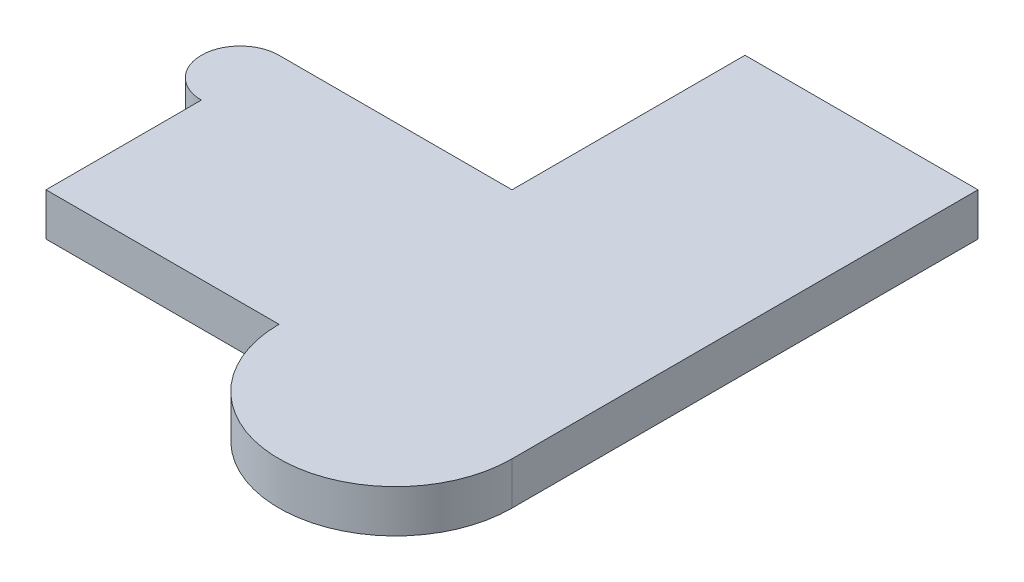
ISO-10303-21;
HEADER;
FILE_DESCRIPTION(('STEP AP214'),'2;1');
FILE_NAME('part.step','',(''),(''),'','','');
FILE_SCHEMA(('AUTOMOTIVE_DESIGN { 1 0 10303 214 1 1 1 1 }'));
ENDSEC;
DATA;
#1=APPLICATION_CONTEXT('core data for automotive mechanical design processes');
#2=APPLICATION_PROTOCOL_DEFINITION('international standard','automotive_design',2000,#1);
#3=PRODUCT_CONTEXT('',#1,'mechanical');
#4=PRODUCT('Part','Part','',(#3));
#5=PRODUCT_RELATED_PRODUCT_CATEGORY('part','',(#4));
#6=PRODUCT_DEFINITION_FORMATION('','',#4);
#7=PRODUCT_DEFINITION_CONTEXT('part definition',#1,'design');
#8=PRODUCT_DEFINITION('design','',#6,#7);
#9=PRODUCT_DEFINITION_SHAPE('','',#8);
#10=(LENGTH_UNIT() NAMED_UNIT(*) SI_UNIT(.MILLI.,.METRE.));
#11=(NAMED_UNIT(*) PLANE_ANGLE_UNIT() SI_UNIT($,.RADIAN.));
#12=(NAMED_UNIT(*) SI_UNIT($,.STERADIAN.) SOLID_ANGLE_UNIT());
#13=UNCERTAINTY_MEASURE_WITH_UNIT(LENGTH_MEASURE(1.E-05),#10,'distance_accuracy_value','');
#14=(GEOMETRIC_REPRESENTATION_CONTEXT(3) GLOBAL_UNCERTAINTY_ASSIGNED_CONTEXT((#13)) GLOBAL_UNIT_ASSIGNED_CONTEXT((#10,
#11,#12)) REPRESENTATION_CONTEXT('',''));
#15=CARTESIAN_POINT('',(0.,0.,0.));
#16=DIRECTION('',(0.,0.,1.));
#17=DIRECTION('',(1.,0.,0.));
#18=AXIS2_PLACEMENT_3D('',#15,#16,#17);
#19=CARTESIAN_POINT('',(-60.,11.,0.));
#20=DIRECTION('',(0.,0.,1.));
#21=DIRECTION('',(1.,0.,0.));
#22=AXIS2_PLACEMENT_3D('',#19,#20,#21);
#23=PLANE('',#22);
#24=DIRECTION('',(-1.,0.,0.));
#25=VECTOR('',#24,1.);
#26=CARTESIAN_POINT('',(-60.,0.,0.));
#27=LINE('',#26,#25);
#28=CARTESIAN_POINT('',(0.,0.,0.));
#29=VERTEX_POINT('',#28);
#30=CARTESIAN_POINT('',(-60.,0.,0.));
#31=VERTEX_POINT('',#30);
#32=EDGE_CURVE('E129',#29,#31,#27,.T.);
#33=ORIENTED_EDGE('',*,*,#32,.T.);
#34=DIRECTION('',(0.,-1.,0.));
#35=VECTOR('',#34,1.);
#36=CARTESIAN_POINT('',(-60.,11.,0.));
#37=LINE('',#36,#35);
#38=CARTESIAN_POINT('',(-60.,11.,0.));
#39=VERTEX_POINT('',#38);
#40=EDGE_CURVE('E11',#39,#31,#37,.T.);
#41=ORIENTED_EDGE('',*,*,#40,.F.);
#42=DIRECTION('',(-1.,0.,0.));
#43=VECTOR('',#42,1.);
#44=CARTESIAN_POINT('',(-60.,11.,0.));
#45=LINE('',#44,#43);
#46=CARTESIAN_POINT('',(0.,11.,0.));
#47=VERTEX_POINT('',#46);
#48=EDGE_CURVE('E143',#47,#39,#45,.T.);
#49=ORIENTED_EDGE('',*,*,#48,.F.);
#50=DIRECTION('',(0.,-1.,0.));
#51=VECTOR('',#50,1.);
#52=CARTESIAN_POINT('',(0.,11.,0.));
#53=LINE('',#52,#51);
#54=EDGE_CURVE('E125',#47,#29,#53,.T.);
#55=ORIENTED_EDGE('',*,*,#54,.T.);
#56=EDGE_LOOP('',(#33,#41,#49,#55));
#57=FACE_BOUND('',#56,.T.);
#58=ADVANCED_FACE('F33',(#57),#23,.F.);
#59=CARTESIAN_POINT('',(-60.,11.,9.99999999999999));
#60=DIRECTION('',(0.,-1.,0.));
#61=DIRECTION('',(0.,0.,-1.));
#62=AXIS2_PLACEMENT_3D('',#59,#60,#61);
#63=CYLINDRICAL_SURFACE('',#62,9.99999999999999);
#64=CARTESIAN_POINT('',(-60.,0.,9.99999999999999));
#65=DIRECTION('',(0.,1.,0.));
#66=DIRECTION('',(0.,0.,-1.));
#67=AXIS2_PLACEMENT_3D('',#64,#65,#66);
#68=CIRCLE('',#67,9.99999999999999);
#69=CARTESIAN_POINT('',(-60.,0.,20.));
#70=VERTEX_POINT('',#69);
#71=EDGE_CURVE('E132',#31,#70,#68,.T.);
#72=ORIENTED_EDGE('',*,*,#71,.T.);
#73=DIRECTION('',(0.,-1.,0.));
#74=VECTOR('',#73,1.);
#75=CARTESIAN_POINT('',(-60.,11.,20.));
#76=LINE('',#75,#74);
#77=CARTESIAN_POINT('',(-60.,11.,20.));
#78=VERTEX_POINT('',#77);
#79=EDGE_CURVE('E41',#78,#70,#76,.T.);
#80=ORIENTED_EDGE('',*,*,#79,.F.);
#81=CARTESIAN_POINT('',(-60.,11.,9.99999999999999));
#82=DIRECTION('',(0.,1.,0.));
#83=DIRECTION('',(0.,0.,-1.));
#84=AXIS2_PLACEMENT_3D('',#81,#82,#83);
#85=CIRCLE('',#84,9.99999999999999);
#86=EDGE_CURVE('E92',#39,#78,#85,.T.);
#87=ORIENTED_EDGE('',*,*,#86,.F.);
#88=ORIENTED_EDGE('',*,*,#40,.T.);
#89=EDGE_LOOP('',(#72,#80,#87,#88));
#90=FACE_BOUND('',#89,.T.);
#91=ADVANCED_FACE('F178',(#90),#63,.T.);
#92=CARTESIAN_POINT('',(-60.,11.,60.));
#93=DIRECTION('',(1.,0.,0.));
#94=DIRECTION('',(0.,0.,-1.));
#95=AXIS2_PLACEMENT_3D('',#92,#93,#94);
#96=PLANE('',#95);
#97=DIRECTION('',(0.,0.,1.));
#98=VECTOR('',#97,1.);
#99=CARTESIAN_POINT('',(-60.,0.,60.));
#100=LINE('',#99,#98);
#101=CARTESIAN_POINT('',(-60.,0.,60.));
#102=VERTEX_POINT('',#101);
#103=EDGE_CURVE('E134',#70,#102,#100,.T.);
#104=ORIENTED_EDGE('',*,*,#103,.T.);
#105=DIRECTION('',(0.,-1.,0.));
#106=VECTOR('',#105,1.);
#107=CARTESIAN_POINT('',(-60.,11.,60.));
#108=LINE('',#107,#106);
#109=CARTESIAN_POINT('',(-60.,11.,60.));
#110=VERTEX_POINT('',#109);
#111=EDGE_CURVE('E150',#110,#102,#108,.T.);
#112=ORIENTED_EDGE('',*,*,#111,.F.);
#113=DIRECTION('',(0.,0.,1.));
#114=VECTOR('',#113,1.);
#115=CARTESIAN_POINT('',(-60.,11.,60.));
#116=LINE('',#115,#114);
#117=EDGE_CURVE('E158',#78,#110,#116,.T.);
#118=ORIENTED_EDGE('',*,*,#117,.F.);
#119=ORIENTED_EDGE('',*,*,#79,.T.);
#120=EDGE_LOOP('',(#104,#112,#118,#119));
#121=FACE_BOUND('',#120,.T.);
#122=ADVANCED_FACE('F156',(#121),#96,.F.);
#123=CARTESIAN_POINT('',(0.,11.,60.));
#124=DIRECTION('',(0.,0.,-1.));
#125=DIRECTION('',(-1.,0.,0.));
#126=AXIS2_PLACEMENT_3D('',#123,#124,#125);
#127=PLANE('',#126);
#128=DIRECTION('',(1.,0.,0.));
#129=VECTOR('',#128,1.);
#130=CARTESIAN_POINT('',(0.,0.,60.));
#131=LINE('',#130,#129);
#132=CARTESIAN_POINT('',(0.,0.,60.));
#133=VERTEX_POINT('',#132);
#134=EDGE_CURVE('E136',#102,#133,#131,.T.);
#135=ORIENTED_EDGE('',*,*,#134,.T.);
#136=DIRECTION('',(0.,-1.,0.));
#137=VECTOR('',#136,1.);
#138=CARTESIAN_POINT('',(0.,11.,60.));
#139=LINE('',#138,#137);
#140=CARTESIAN_POINT('',(0.,11.,60.));
#141=VERTEX_POINT('',#140);
#142=EDGE_CURVE('E147',#141,#133,#139,.T.);
#143=ORIENTED_EDGE('',*,*,#142,.F.);
#144=DIRECTION('',(1.,0.,0.));
#145=VECTOR('',#144,1.);
#146=CARTESIAN_POINT('',(0.,11.,60.));
#147=LINE('',#146,#145);
#148=EDGE_CURVE('E170',#110,#141,#147,.T.);
#149=ORIENTED_EDGE('',*,*,#148,.F.);
#150=ORIENTED_EDGE('',*,*,#111,.T.);
#151=EDGE_LOOP('',(#135,#143,#149,#150));
#152=FACE_BOUND('',#151,.T.);
#153=ADVANCED_FACE('F166',(#152),#127,.F.);
#154=CARTESIAN_POINT('',(30.,11.,60.));
#155=DIRECTION('',(0.,-1.,0.));
#156=DIRECTION('',(0.,0.,-1.));
#157=AXIS2_PLACEMENT_3D('',#154,#155,#156);
#158=CYLINDRICAL_SURFACE('',#157,30.);
#159=CARTESIAN_POINT('',(30.,0.,60.));
#160=DIRECTION('',(0.,1.,0.));
#161=DIRECTION('',(0.,0.,-1.));
#162=AXIS2_PLACEMENT_3D('',#159,#160,#161);
#163=CIRCLE('',#162,30.);
#164=CARTESIAN_POINT('',(60.,0.,60.));
#165=VERTEX_POINT('',#164);
#166=EDGE_CURVE('E138',#133,#165,#163,.T.);
#167=ORIENTED_EDGE('',*,*,#166,.T.);
#168=DIRECTION('',(0.,-1.,0.));
#169=VECTOR('',#168,1.);
#170=CARTESIAN_POINT('',(60.,11.,60.));
#171=LINE('',#170,#169);
#172=CARTESIAN_POINT('',(60.,11.,60.));
#173=VERTEX_POINT('',#172);
#174=EDGE_CURVE('E120',#173,#165,#171,.T.);
#175=ORIENTED_EDGE('',*,*,#174,.F.);
#176=CARTESIAN_POINT('',(30.,11.,60.));
#177=DIRECTION('',(0.,1.,0.));
#178=DIRECTION('',(0.,0.,-1.));
#179=AXIS2_PLACEMENT_3D('',#176,#177,#178);
#180=CIRCLE('',#179,30.);
#181=EDGE_CURVE('E111',#141,#173,#180,.T.);
#182=ORIENTED_EDGE('',*,*,#181,.F.);
#183=ORIENTED_EDGE('',*,*,#142,.T.);
#184=EDGE_LOOP('',(#167,#175,#182,#183));
#185=FACE_BOUND('',#184,.T.);
#186=ADVANCED_FACE('F169',(#185),#158,.T.);
#187=CARTESIAN_POINT('',(60.,11.,-60.));
#188=DIRECTION('',(-1.,0.,0.));
#189=DIRECTION('',(0.,0.,1.));
#190=AXIS2_PLACEMENT_3D('',#187,#188,#189);
#191=PLANE('',#190);
#192=DIRECTION('',(0.,0.,-1.));
#193=VECTOR('',#192,1.);
#194=CARTESIAN_POINT('',(60.,0.,-60.));
#195=LINE('',#194,#193);
#196=CARTESIAN_POINT('',(60.,0.,-60.));
#197=VERTEX_POINT('',#196);
#198=EDGE_CURVE('E119',#165,#197,#195,.T.);
#199=ORIENTED_EDGE('',*,*,#198,.T.);
#200=DIRECTION('',(0.,-1.,0.));
#201=VECTOR('',#200,1.);
#202=CARTESIAN_POINT('',(60.,11.,-60.));
#203=LINE('',#202,#201);
#204=CARTESIAN_POINT('',(60.,11.,-60.));
#205=VERTEX_POINT('',#204);
#206=EDGE_CURVE('E116',#205,#197,#203,.T.);
#207=ORIENTED_EDGE('',*,*,#206,.F.);
#208=DIRECTION('',(0.,0.,-1.));
#209=VECTOR('',#208,1.);
#210=CARTESIAN_POINT('',(60.,11.,-60.));
#211=LINE('',#210,#209);
#212=EDGE_CURVE('E105',#173,#205,#211,.T.);
#213=ORIENTED_EDGE('',*,*,#212,.F.);
#214=ORIENTED_EDGE('',*,*,#174,.T.);
#215=EDGE_LOOP('',(#199,#207,#213,#214));
#216=FACE_BOUND('',#215,.T.);
#217=ADVANCED_FACE('F117',(#216),#191,.F.);
#218=CARTESIAN_POINT('',(0.,11.,-60.));
#219=DIRECTION('',(0.,0.,1.));
#220=DIRECTION('',(1.,0.,0.));
#221=AXIS2_PLACEMENT_3D('',#218,#219,#220);
#222=PLANE('',#221);
#223=DIRECTION('',(-1.,0.,0.));
#224=VECTOR('',#223,1.);
#225=CARTESIAN_POINT('',(0.,0.,-60.));
#226=LINE('',#225,#224);
#227=CARTESIAN_POINT('',(0.,0.,-60.));
#228=VERTEX_POINT('',#227);
#229=EDGE_CURVE('E78',#197,#228,#226,.T.);
#230=ORIENTED_EDGE('',*,*,#229,.T.);
#231=DIRECTION('',(0.,-1.,0.));
#232=VECTOR('',#231,1.);
#233=CARTESIAN_POINT('',(0.,11.,-60.));
#234=LINE('',#233,#232);
#235=CARTESIAN_POINT('',(0.,11.,-60.));
#236=VERTEX_POINT('',#235);
#237=EDGE_CURVE('E121',#236,#228,#234,.T.);
#238=ORIENTED_EDGE('',*,*,#237,.F.);
#239=DIRECTION('',(-1.,0.,0.));
#240=VECTOR('',#239,1.);
#241=CARTESIAN_POINT('',(0.,11.,-60.));
#242=LINE('',#241,#240);
#243=EDGE_CURVE('E109',#205,#236,#242,.T.);
#244=ORIENTED_EDGE('',*,*,#243,.F.);
#245=ORIENTED_EDGE('',*,*,#206,.T.);
#246=EDGE_LOOP('',(#230,#238,#244,#245));
#247=FACE_BOUND('',#246,.T.);
#248=ADVANCED_FACE('F123',(#247),#222,.F.);
#249=CARTESIAN_POINT('',(0.,11.,0.));
#250=DIRECTION('',(1.,0.,0.));
#251=DIRECTION('',(0.,0.,-1.));
#252=AXIS2_PLACEMENT_3D('',#249,#250,#251);
#253=PLANE('',#252);
#254=DIRECTION('',(0.,0.,1.));
#255=VECTOR('',#254,1.);
#256=CARTESIAN_POINT('',(0.,0.,0.));
#257=LINE('',#256,#255);
#258=EDGE_CURVE('E84',#228,#29,#257,.T.);
#259=ORIENTED_EDGE('',*,*,#258,.T.);
#260=ORIENTED_EDGE('',*,*,#54,.F.);
#261=DIRECTION('',(0.,0.,1.));
#262=VECTOR('',#261,1.);
#263=CARTESIAN_POINT('',(0.,11.,0.));
#264=LINE('',#263,#262);
#265=EDGE_CURVE('E49',#236,#47,#264,.T.);
#266=ORIENTED_EDGE('',*,*,#265,.F.);
#267=ORIENTED_EDGE('',*,*,#237,.T.);
#268=EDGE_LOOP('',(#259,#260,#266,#267));
#269=FACE_BOUND('',#268,.T.);
#270=ADVANCED_FACE('F194',(#269),#253,.F.);
#271=CARTESIAN_POINT('',(30.,11.,60.));
#272=DIRECTION('',(0.,-1.,0.));
#273=DIRECTION('',(0.,0.,-1.));
#274=AXIS2_PLACEMENT_3D('',#271,#272,#273);
#275=PLANE('',#274);
#276=ORIENTED_EDGE('',*,*,#48,.T.);
#277=ORIENTED_EDGE('',*,*,#86,.T.);
#278=ORIENTED_EDGE('',*,*,#117,.T.);
#279=ORIENTED_EDGE('',*,*,#148,.T.);
#280=ORIENTED_EDGE('',*,*,#181,.T.);
#281=ORIENTED_EDGE('',*,*,#212,.T.);
#282=ORIENTED_EDGE('',*,*,#243,.T.);
#283=ORIENTED_EDGE('',*,*,#265,.T.);
#284=EDGE_LOOP('',(#276,#277,#278,#279,#280,#281,#282,#283));
#285=FACE_BOUND('',#284,.T.);
#286=ADVANCED_FACE('F107',(#285),#275,.F.);
#287=CARTESIAN_POINT('',(30.,0.,60.));
#288=DIRECTION('',(0.,-1.,0.));
#289=DIRECTION('',(0.,0.,-1.));
#290=AXIS2_PLACEMENT_3D('',#287,#288,#289);
#291=PLANE('',#290);
#292=ORIENTED_EDGE('',*,*,#32,.F.);
#293=ORIENTED_EDGE('',*,*,#258,.F.);
#294=ORIENTED_EDGE('',*,*,#229,.F.);
#295=ORIENTED_EDGE('',*,*,#198,.F.);
#296=ORIENTED_EDGE('',*,*,#166,.F.);
#297=ORIENTED_EDGE('',*,*,#134,.F.);
#298=ORIENTED_EDGE('',*,*,#103,.F.);
#299=ORIENTED_EDGE('',*,*,#71,.F.);
#300=EDGE_LOOP('',(#292,#293,#294,#295,#296,#297,#298,#299));
#301=FACE_BOUND('',#300,.T.);
#302=ADVANCED_FACE('F162',(#301),#291,.T.);
#303=CLOSED_SHELL('',(#58,#91,#122,#153,#186,#217,#248,#270,#286,#302));
#304=MANIFOLD_SOLID_BREP('B2',#303);
#305=ADVANCED_BREP_SHAPE_REPRESENTATION('',(#18,#304),#14);
#306=SHAPE_DEFINITION_REPRESENTATION(#9,#305);
ENDSEC;
END-ISO-10303-21;
